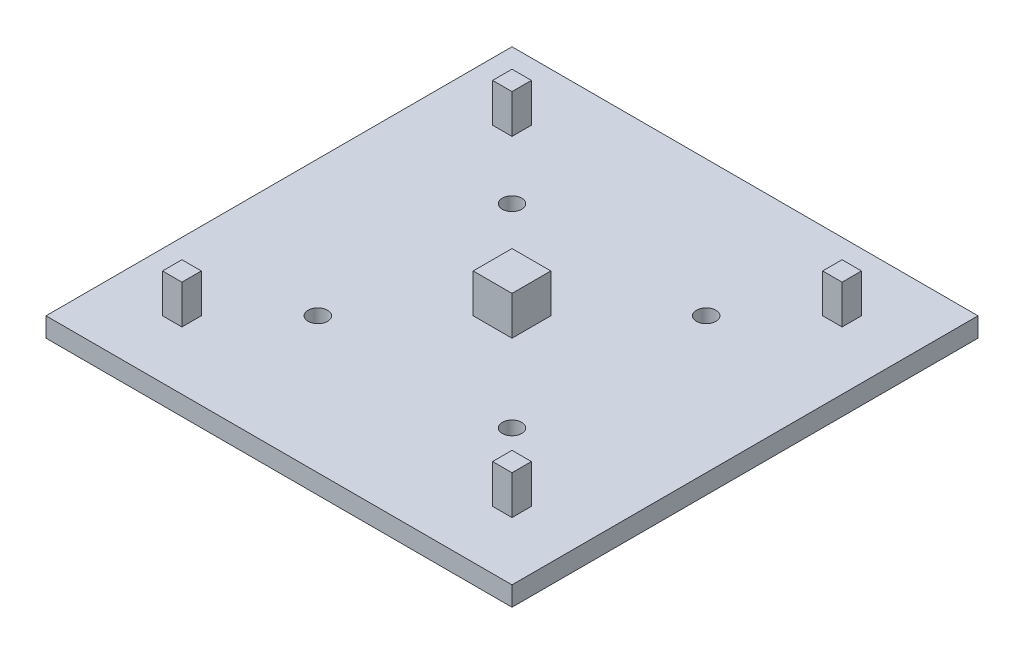
ISO-10303-21;
HEADER;
FILE_DESCRIPTION(('STEP AP214'),'2;1');
FILE_NAME('part.step','',(''),(''),'','','');
FILE_SCHEMA(('AUTOMOTIVE_DESIGN { 1 0 10303 214 1 1 1 1 }'));
ENDSEC;
DATA;
#1=APPLICATION_CONTEXT('core data for automotive mechanical design processes');
#2=APPLICATION_PROTOCOL_DEFINITION('international standard','automotive_design',2000,#1);
#3=PRODUCT_CONTEXT('',#1,'mechanical');
#4=PRODUCT('Part','Part','',(#3));
#5=PRODUCT_RELATED_PRODUCT_CATEGORY('part','',(#4));
#6=PRODUCT_DEFINITION_FORMATION('','',#4);
#7=PRODUCT_DEFINITION_CONTEXT('part definition',#1,'design');
#8=PRODUCT_DEFINITION('design','',#6,#7);
#9=PRODUCT_DEFINITION_SHAPE('','',#8);
#10=(LENGTH_UNIT() NAMED_UNIT(*) SI_UNIT(.MILLI.,.METRE.));
#11=(NAMED_UNIT(*) PLANE_ANGLE_UNIT() SI_UNIT($,.RADIAN.));
#12=(NAMED_UNIT(*) SI_UNIT($,.STERADIAN.) SOLID_ANGLE_UNIT());
#13=UNCERTAINTY_MEASURE_WITH_UNIT(LENGTH_MEASURE(1.E-05),#10,'distance_accuracy_value','');
#14=(GEOMETRIC_REPRESENTATION_CONTEXT(3) GLOBAL_UNCERTAINTY_ASSIGNED_CONTEXT((#13)) GLOBAL_UNIT_ASSIGNED_CONTEXT((#10,
#11,#12)) REPRESENTATION_CONTEXT('',''));
#15=CARTESIAN_POINT('',(0.,0.,0.));
#16=DIRECTION('',(0.,0.,1.));
#17=DIRECTION('',(1.,0.,0.));
#18=AXIS2_PLACEMENT_3D('',#15,#16,#17);
#19=CARTESIAN_POINT('',(0.,5.,0.));
#20=DIRECTION('',(0.,1.,0.));
#21=DIRECTION('',(0.,0.,1.));
#22=AXIS2_PLACEMENT_3D('',#19,#20,#21);
#23=PLANE('',#22);
#24=CARTESIAN_POINT('',(-25.,5.,25.));
#25=DIRECTION('',(0.,1.,0.));
#26=DIRECTION('',(0.,0.,1.));
#27=AXIS2_PLACEMENT_3D('',#24,#25,#26);
#28=CIRCLE('',#27,2.5);
#29=CARTESIAN_POINT('',(-25.,5.,27.5));
#30=VERTEX_POINT('',#29);
#31=EDGE_CURVE('E397',#30,#30,#28,.T.);
#32=ORIENTED_EDGE('',*,*,#31,.F.);
#33=EDGE_LOOP('',(#32));
#34=FACE_BOUND('',#33,.T.);
#35=CARTESIAN_POINT('',(25.,5.,25.));
#36=DIRECTION('',(0.,1.,0.));
#37=DIRECTION('',(0.,0.,1.));
#38=AXIS2_PLACEMENT_3D('',#35,#36,#37);
#39=CIRCLE('',#38,2.5);
#40=CARTESIAN_POINT('',(25.,5.,27.5));
#41=VERTEX_POINT('',#40);
#42=EDGE_CURVE('E402',#41,#41,#39,.T.);
#43=ORIENTED_EDGE('',*,*,#42,.F.);
#44=EDGE_LOOP('',(#43));
#45=FACE_BOUND('',#44,.T.);
#46=CARTESIAN_POINT('',(25.,5.,-25.));
#47=DIRECTION('',(0.,1.,0.));
#48=DIRECTION('',(0.,0.,1.));
#49=AXIS2_PLACEMENT_3D('',#46,#47,#48);
#50=CIRCLE('',#49,2.5);
#51=CARTESIAN_POINT('',(25.,5.,-22.5));
#52=VERTEX_POINT('',#51);
#53=EDGE_CURVE('E410',#52,#52,#50,.T.);
#54=ORIENTED_EDGE('',*,*,#53,.F.);
#55=EDGE_LOOP('',(#54));
#56=FACE_BOUND('',#55,.T.);
#57=CARTESIAN_POINT('',(-25.,5.,-25.));
#58=DIRECTION('',(0.,1.,0.));
#59=DIRECTION('',(0.,0.,1.));
#60=AXIS2_PLACEMENT_3D('',#57,#58,#59);
#61=CIRCLE('',#60,2.5);
#62=CARTESIAN_POINT('',(-25.,5.,-22.5));
#63=VERTEX_POINT('',#62);
#64=EDGE_CURVE('E418',#63,#63,#61,.T.);
#65=ORIENTED_EDGE('',*,*,#64,.F.);
#66=EDGE_LOOP('',(#65));
#67=FACE_BOUND('',#66,.T.);
#68=DIRECTION('',(0.,0.,-1.));
#69=VECTOR('',#68,1.);
#70=CARTESIAN_POINT('',(60.,5.,-60.));
#71=LINE('',#70,#69);
#72=CARTESIAN_POINT('',(60.,5.,60.));
#73=VERTEX_POINT('',#72);
#74=CARTESIAN_POINT('',(60.,5.,-60.));
#75=VERTEX_POINT('',#74);
#76=EDGE_CURVE('E430',#73,#75,#71,.T.);
#77=ORIENTED_EDGE('',*,*,#76,.T.);
#78=DIRECTION('',(-1.,0.,0.));
#79=VECTOR('',#78,1.);
#80=CARTESIAN_POINT('',(-60.,5.,-60.));
#81=LINE('',#80,#79);
#82=CARTESIAN_POINT('',(-60.,5.,-60.));
#83=VERTEX_POINT('',#82);
#84=EDGE_CURVE('E434',#75,#83,#81,.T.);
#85=ORIENTED_EDGE('',*,*,#84,.T.);
#86=DIRECTION('',(0.,0.,1.));
#87=VECTOR('',#86,1.);
#88=CARTESIAN_POINT('',(-60.,5.,-60.));
#89=LINE('',#88,#87);
#90=CARTESIAN_POINT('',(-60.,5.,60.));
#91=VERTEX_POINT('',#90);
#92=EDGE_CURVE('E438',#83,#91,#89,.T.);
#93=ORIENTED_EDGE('',*,*,#92,.T.);
#94=DIRECTION('',(1.,0.,0.));
#95=VECTOR('',#94,1.);
#96=CARTESIAN_POINT('',(-60.,5.,60.));
#97=LINE('',#96,#95);
#98=EDGE_CURVE('E441',#91,#73,#97,.T.);
#99=ORIENTED_EDGE('',*,*,#98,.T.);
#100=EDGE_LOOP('',(#77,#85,#93,#99));
#101=FACE_BOUND('',#100,.T.);
#102=DIRECTION('',(-1.,0.,0.));
#103=VECTOR('',#102,1.);
#104=CARTESIAN_POINT('',(-5.,5.,-5.));
#105=LINE('',#104,#103);
#106=CARTESIAN_POINT('',(5.,5.,-5.));
#107=VERTEX_POINT('',#106);
#108=CARTESIAN_POINT('',(-5.,5.,-5.));
#109=VERTEX_POINT('',#108);
#110=EDGE_CURVE('E375',#107,#109,#105,.T.);
#111=ORIENTED_EDGE('',*,*,#110,.F.);
#112=DIRECTION('',(0.,0.,-1.));
#113=VECTOR('',#112,1.);
#114=CARTESIAN_POINT('',(5.,5.,-5.));
#115=LINE('',#114,#113);
#116=CARTESIAN_POINT('',(5.,5.,5.));
#117=VERTEX_POINT('',#116);
#118=EDGE_CURVE('E356',#117,#107,#115,.T.);
#119=ORIENTED_EDGE('',*,*,#118,.F.);
#120=DIRECTION('',(1.,0.,0.));
#121=VECTOR('',#120,1.);
#122=CARTESIAN_POINT('',(-5.,5.,5.));
#123=LINE('',#122,#121);
#124=CARTESIAN_POINT('',(-5.,5.,5.));
#125=VERTEX_POINT('',#124);
#126=EDGE_CURVE('E362',#125,#117,#123,.T.);
#127=ORIENTED_EDGE('',*,*,#126,.F.);
#128=DIRECTION('',(0.,0.,1.));
#129=VECTOR('',#128,1.);
#130=CARTESIAN_POINT('',(-5.,5.,-5.));
#131=LINE('',#130,#129);
#132=EDGE_CURVE('E378',#109,#125,#131,.T.);
#133=ORIENTED_EDGE('',*,*,#132,.F.);
#134=EDGE_LOOP('',(#111,#119,#127,#133));
#135=FACE_BOUND('',#134,.T.);
#136=DIRECTION('',(-1.,0.,0.));
#137=VECTOR('',#136,1.);
#138=CARTESIAN_POINT('',(40.,5.,-45.));
#139=LINE('',#138,#137);
#140=CARTESIAN_POINT('',(45.,5.,-45.));
#141=VERTEX_POINT('',#140);
#142=CARTESIAN_POINT('',(40.,5.,-45.));
#143=VERTEX_POINT('',#142);
#144=EDGE_CURVE('E334',#141,#143,#139,.T.);
#145=ORIENTED_EDGE('',*,*,#144,.F.);
#146=DIRECTION('',(0.,0.,-1.));
#147=VECTOR('',#146,1.);
#148=CARTESIAN_POINT('',(45.,5.,-45.));
#149=LINE('',#148,#147);
#150=CARTESIAN_POINT('',(45.,5.,-40.));
#151=VERTEX_POINT('',#150);
#152=EDGE_CURVE('E315',#151,#141,#149,.T.);
#153=ORIENTED_EDGE('',*,*,#152,.F.);
#154=DIRECTION('',(1.,0.,0.));
#155=VECTOR('',#154,1.);
#156=CARTESIAN_POINT('',(40.,5.,-40.));
#157=LINE('',#156,#155);
#158=CARTESIAN_POINT('',(40.,5.,-40.));
#159=VERTEX_POINT('',#158);
#160=EDGE_CURVE('E321',#159,#151,#157,.T.);
#161=ORIENTED_EDGE('',*,*,#160,.F.);
#162=DIRECTION('',(0.,0.,1.));
#163=VECTOR('',#162,1.);
#164=CARTESIAN_POINT('',(40.,5.,-45.));
#165=LINE('',#164,#163);
#166=EDGE_CURVE('E337',#143,#159,#165,.T.);
#167=ORIENTED_EDGE('',*,*,#166,.F.);
#168=EDGE_LOOP('',(#145,#153,#161,#167));
#169=FACE_BOUND('',#168,.T.);
#170=DIRECTION('',(-1.,0.,0.));
#171=VECTOR('',#170,1.);
#172=CARTESIAN_POINT('',(-45.,5.,-45.));
#173=LINE('',#172,#171);
#174=CARTESIAN_POINT('',(-40.,5.,-45.));
#175=VERTEX_POINT('',#174);
#176=CARTESIAN_POINT('',(-45.,5.,-45.));
#177=VERTEX_POINT('',#176);
#178=EDGE_CURVE('E293',#175,#177,#173,.T.);
#179=ORIENTED_EDGE('',*,*,#178,.F.);
#180=DIRECTION('',(0.,0.,-1.));
#181=VECTOR('',#180,1.);
#182=CARTESIAN_POINT('',(-40.,5.,-45.));
#183=LINE('',#182,#181);
#184=CARTESIAN_POINT('',(-40.,5.,-40.));
#185=VERTEX_POINT('',#184);
#186=EDGE_CURVE('E274',#185,#175,#183,.T.);
#187=ORIENTED_EDGE('',*,*,#186,.F.);
#188=DIRECTION('',(1.,0.,0.));
#189=VECTOR('',#188,1.);
#190=CARTESIAN_POINT('',(-45.,5.,-40.));
#191=LINE('',#190,#189);
#192=CARTESIAN_POINT('',(-45.,5.,-40.));
#193=VERTEX_POINT('',#192);
#194=EDGE_CURVE('E280',#193,#185,#191,.T.);
#195=ORIENTED_EDGE('',*,*,#194,.F.);
#196=DIRECTION('',(0.,0.,1.));
#197=VECTOR('',#196,1.);
#198=CARTESIAN_POINT('',(-45.,5.,-45.));
#199=LINE('',#198,#197);
#200=EDGE_CURVE('E296',#177,#193,#199,.T.);
#201=ORIENTED_EDGE('',*,*,#200,.F.);
#202=EDGE_LOOP('',(#179,#187,#195,#201));
#203=FACE_BOUND('',#202,.T.);
#204=DIRECTION('',(-1.,0.,0.));
#205=VECTOR('',#204,1.);
#206=CARTESIAN_POINT('',(40.,5.,40.));
#207=LINE('',#206,#205);
#208=CARTESIAN_POINT('',(45.,5.,40.));
#209=VERTEX_POINT('',#208);
#210=CARTESIAN_POINT('',(40.,5.,40.));
#211=VERTEX_POINT('',#210);
#212=EDGE_CURVE('E235',#209,#211,#207,.T.);
#213=ORIENTED_EDGE('',*,*,#212,.F.);
#214=DIRECTION('',(0.,0.,-1.));
#215=VECTOR('',#214,1.);
#216=CARTESIAN_POINT('',(45.,5.,40.));
#217=LINE('',#216,#215);
#218=CARTESIAN_POINT('',(45.,5.,45.));
#219=VERTEX_POINT('',#218);
#220=EDGE_CURVE('E230',#219,#209,#217,.T.);
#221=ORIENTED_EDGE('',*,*,#220,.F.);
#222=DIRECTION('',(1.,0.,0.));
#223=VECTOR('',#222,1.);
#224=CARTESIAN_POINT('',(40.,5.,45.));
#225=LINE('',#224,#223);
#226=CARTESIAN_POINT('',(40.,5.,45.));
#227=VERTEX_POINT('',#226);
#228=EDGE_CURVE('E245',#227,#219,#225,.T.);
#229=ORIENTED_EDGE('',*,*,#228,.F.);
#230=DIRECTION('',(0.,0.,1.));
#231=VECTOR('',#230,1.);
#232=CARTESIAN_POINT('',(40.,5.,40.));
#233=LINE('',#232,#231);
#234=EDGE_CURVE('E257',#211,#227,#233,.T.);
#235=ORIENTED_EDGE('',*,*,#234,.F.);
#236=EDGE_LOOP('',(#213,#221,#229,#235));
#237=FACE_BOUND('',#236,.T.);
#238=DIRECTION('',(-1.,0.,0.));
#239=VECTOR('',#238,1.);
#240=CARTESIAN_POINT('',(-45.,5.,40.));
#241=LINE('',#240,#239);
#242=CARTESIAN_POINT('',(-40.,5.,40.));
#243=VERTEX_POINT('',#242);
#244=CARTESIAN_POINT('',(-45.,5.,40.));
#245=VERTEX_POINT('',#244);
#246=EDGE_CURVE('E826',#243,#245,#241,.T.);
#247=ORIENTED_EDGE('',*,*,#246,.F.);
#248=DIRECTION('',(0.,0.,-1.));
#249=VECTOR('',#248,1.);
#250=CARTESIAN_POINT('',(-40.,5.,40.));
#251=LINE('',#250,#249);
#252=CARTESIAN_POINT('',(-40.,5.,45.));
#253=VERTEX_POINT('',#252);
#254=EDGE_CURVE('E227',#253,#243,#251,.T.);
#255=ORIENTED_EDGE('',*,*,#254,.F.);
#256=DIRECTION('',(1.,0.,0.));
#257=VECTOR('',#256,1.);
#258=CARTESIAN_POINT('',(-45.,5.,45.));
#259=LINE('',#258,#257);
#260=CARTESIAN_POINT('',(-45.,5.,45.));
#261=VERTEX_POINT('',#260);
#262=EDGE_CURVE('E223',#261,#253,#259,.T.);
#263=ORIENTED_EDGE('',*,*,#262,.F.);
#264=DIRECTION('',(0.,0.,1.));
#265=VECTOR('',#264,1.);
#266=CARTESIAN_POINT('',(-45.,5.,40.));
#267=LINE('',#266,#265);
#268=EDGE_CURVE('E822',#245,#261,#267,.T.);
#269=ORIENTED_EDGE('',*,*,#268,.F.);
#270=EDGE_LOOP('',(#247,#255,#263,#269));
#271=FACE_BOUND('',#270,.T.);
#272=ADVANCED_FACE('F39',(#34,#45,#56,#67,#101,#135,#169,#203,#237,#271),#23,.T.);
#273=CARTESIAN_POINT('',(60.,5.,-60.));
#274=DIRECTION('',(-1.,0.,0.));
#275=DIRECTION('',(0.,0.,1.));
#276=AXIS2_PLACEMENT_3D('',#273,#274,#275);
#277=PLANE('',#276);
#278=DIRECTION('',(0.,0.,-1.));
#279=VECTOR('',#278,1.);
#280=CARTESIAN_POINT('',(60.,0.,-60.));
#281=LINE('',#280,#279);
#282=CARTESIAN_POINT('',(60.,0.,60.));
#283=VERTEX_POINT('',#282);
#284=CARTESIAN_POINT('',(60.,0.,-60.));
#285=VERTEX_POINT('',#284);
#286=EDGE_CURVE('E426',#283,#285,#281,.T.);
#287=ORIENTED_EDGE('',*,*,#286,.T.);
#288=DIRECTION('',(0.,-1.,0.));
#289=VECTOR('',#288,1.);
#290=CARTESIAN_POINT('',(60.,5.,-60.));
#291=LINE('',#290,#289);
#292=EDGE_CURVE('E11',#75,#285,#291,.T.);
#293=ORIENTED_EDGE('',*,*,#292,.F.);
#294=ORIENTED_EDGE('',*,*,#76,.F.);
#295=DIRECTION('',(0.,-1.,0.));
#296=VECTOR('',#295,1.);
#297=CARTESIAN_POINT('',(60.,5.,60.));
#298=LINE('',#297,#296);
#299=EDGE_CURVE('E444',#73,#283,#298,.T.);
#300=ORIENTED_EDGE('',*,*,#299,.T.);
#301=EDGE_LOOP('',(#287,#293,#294,#300));
#302=FACE_BOUND('',#301,.T.);
#303=ADVANCED_FACE('F41',(#302),#277,.F.);
#304=CARTESIAN_POINT('',(-60.,5.,-60.));
#305=DIRECTION('',(0.,0.,1.));
#306=DIRECTION('',(1.,0.,0.));
#307=AXIS2_PLACEMENT_3D('',#304,#305,#306);
#308=PLANE('',#307);
#309=DIRECTION('',(-1.,0.,0.));
#310=VECTOR('',#309,1.);
#311=CARTESIAN_POINT('',(-60.,0.,-60.));
#312=LINE('',#311,#310);
#313=CARTESIAN_POINT('',(-60.,0.,-60.));
#314=VERTEX_POINT('',#313);
#315=EDGE_CURVE('E448',#285,#314,#312,.T.);
#316=ORIENTED_EDGE('',*,*,#315,.T.);
#317=DIRECTION('',(0.,-1.,0.));
#318=VECTOR('',#317,1.);
#319=CARTESIAN_POINT('',(-60.,5.,-60.));
#320=LINE('',#319,#318);
#321=EDGE_CURVE('E48',#83,#314,#320,.T.);
#322=ORIENTED_EDGE('',*,*,#321,.F.);
#323=ORIENTED_EDGE('',*,*,#84,.F.);
#324=ORIENTED_EDGE('',*,*,#292,.T.);
#325=EDGE_LOOP('',(#316,#322,#323,#324));
#326=FACE_BOUND('',#325,.T.);
#327=ADVANCED_FACE('F484',(#326),#308,.F.);
#328=CARTESIAN_POINT('',(-60.,5.,-60.));
#329=DIRECTION('',(1.,0.,0.));
#330=DIRECTION('',(0.,0.,-1.));
#331=AXIS2_PLACEMENT_3D('',#328,#329,#330);
#332=PLANE('',#331);
#333=DIRECTION('',(0.,0.,1.));
#334=VECTOR('',#333,1.);
#335=CARTESIAN_POINT('',(-60.,0.,-60.));
#336=LINE('',#335,#334);
#337=CARTESIAN_POINT('',(-60.,0.,60.));
#338=VERTEX_POINT('',#337);
#339=EDGE_CURVE('E451',#314,#338,#336,.T.);
#340=ORIENTED_EDGE('',*,*,#339,.T.);
#341=DIRECTION('',(0.,-1.,0.));
#342=VECTOR('',#341,1.);
#343=CARTESIAN_POINT('',(-60.,5.,60.));
#344=LINE('',#343,#342);
#345=EDGE_CURVE('E459',#91,#338,#344,.T.);
#346=ORIENTED_EDGE('',*,*,#345,.F.);
#347=ORIENTED_EDGE('',*,*,#92,.F.);
#348=ORIENTED_EDGE('',*,*,#321,.T.);
#349=EDGE_LOOP('',(#340,#346,#347,#348));
#350=FACE_BOUND('',#349,.T.);
#351=ADVANCED_FACE('F468',(#350),#332,.F.);
#352=CARTESIAN_POINT('',(-60.,5.,60.));
#353=DIRECTION('',(0.,0.,-1.));
#354=DIRECTION('',(-1.,0.,0.));
#355=AXIS2_PLACEMENT_3D('',#352,#353,#354);
#356=PLANE('',#355);
#357=DIRECTION('',(1.,0.,0.));
#358=VECTOR('',#357,1.);
#359=CARTESIAN_POINT('',(-60.,0.,60.));
#360=LINE('',#359,#358);
#361=EDGE_CURVE('E435',#338,#283,#360,.T.);
#362=ORIENTED_EDGE('',*,*,#361,.T.);
#363=ORIENTED_EDGE('',*,*,#299,.F.);
#364=ORIENTED_EDGE('',*,*,#98,.F.);
#365=ORIENTED_EDGE('',*,*,#345,.T.);
#366=EDGE_LOOP('',(#362,#363,#364,#365));
#367=FACE_BOUND('',#366,.T.);
#368=ADVANCED_FACE('F477',(#367),#356,.F.);
#369=CARTESIAN_POINT('',(0.,0.,0.));
#370=DIRECTION('',(0.,1.,0.));
#371=DIRECTION('',(0.,0.,1.));
#372=AXIS2_PLACEMENT_3D('',#369,#370,#371);
#373=PLANE('',#372);
#374=CARTESIAN_POINT('',(-25.,0.,25.));
#375=DIRECTION('',(0.,1.,0.));
#376=DIRECTION('',(0.,0.,1.));
#377=AXIS2_PLACEMENT_3D('',#374,#375,#376);
#378=CIRCLE('',#377,2.5);
#379=CARTESIAN_POINT('',(-25.,0.,27.5));
#380=VERTEX_POINT('',#379);
#381=EDGE_CURVE('E398',#380,#380,#378,.T.);
#382=ORIENTED_EDGE('',*,*,#381,.T.);
#383=EDGE_LOOP('',(#382));
#384=FACE_BOUND('',#383,.T.);
#385=CARTESIAN_POINT('',(25.,0.,25.));
#386=DIRECTION('',(0.,1.,0.));
#387=DIRECTION('',(0.,0.,1.));
#388=AXIS2_PLACEMENT_3D('',#385,#386,#387);
#389=CIRCLE('',#388,2.5);
#390=CARTESIAN_POINT('',(25.,0.,27.5));
#391=VERTEX_POINT('',#390);
#392=EDGE_CURVE('E406',#391,#391,#389,.T.);
#393=ORIENTED_EDGE('',*,*,#392,.T.);
#394=EDGE_LOOP('',(#393));
#395=FACE_BOUND('',#394,.T.);
#396=CARTESIAN_POINT('',(25.,0.,-25.));
#397=DIRECTION('',(0.,1.,0.));
#398=DIRECTION('',(0.,0.,1.));
#399=AXIS2_PLACEMENT_3D('',#396,#397,#398);
#400=CIRCLE('',#399,2.5);
#401=CARTESIAN_POINT('',(25.,0.,-22.5));
#402=VERTEX_POINT('',#401);
#403=EDGE_CURVE('E414',#402,#402,#400,.T.);
#404=ORIENTED_EDGE('',*,*,#403,.T.);
#405=EDGE_LOOP('',(#404));
#406=FACE_BOUND('',#405,.T.);
#407=CARTESIAN_POINT('',(-25.,0.,-25.));
#408=DIRECTION('',(0.,1.,0.));
#409=DIRECTION('',(0.,0.,1.));
#410=AXIS2_PLACEMENT_3D('',#407,#408,#409);
#411=CIRCLE('',#410,2.5);
#412=CARTESIAN_POINT('',(-25.,0.,-22.5));
#413=VERTEX_POINT('',#412);
#414=EDGE_CURVE('E422',#413,#413,#411,.T.);
#415=ORIENTED_EDGE('',*,*,#414,.T.);
#416=EDGE_LOOP('',(#415));
#417=FACE_BOUND('',#416,.T.);
#418=ORIENTED_EDGE('',*,*,#286,.F.);
#419=ORIENTED_EDGE('',*,*,#361,.F.);
#420=ORIENTED_EDGE('',*,*,#339,.F.);
#421=ORIENTED_EDGE('',*,*,#315,.F.);
#422=EDGE_LOOP('',(#418,#419,#420,#421));
#423=FACE_BOUND('',#422,.T.);
#424=ADVANCED_FACE('F474',(#384,#395,#406,#417,#423),#373,.F.);
#425=CARTESIAN_POINT('',(-25.,0.,-25.));
#426=DIRECTION('',(0.,1.,0.));
#427=DIRECTION('',(0.,0.,1.));
#428=AXIS2_PLACEMENT_3D('',#425,#426,#427);
#429=CYLINDRICAL_SURFACE('',#428,2.5);
#430=ORIENTED_EDGE('',*,*,#414,.F.);
#431=EDGE_LOOP('',(#430));
#432=FACE_BOUND('',#431,.T.);
#433=ORIENTED_EDGE('',*,*,#64,.T.);
#434=EDGE_LOOP('',(#433));
#435=FACE_BOUND('',#434,.T.);
#436=ADVANCED_FACE('F500',(#432,#435),#429,.F.);
#437=CARTESIAN_POINT('',(25.,0.,-25.));
#438=DIRECTION('',(0.,1.,0.));
#439=DIRECTION('',(0.,0.,1.));
#440=AXIS2_PLACEMENT_3D('',#437,#438,#439);
#441=CYLINDRICAL_SURFACE('',#440,2.5);
#442=ORIENTED_EDGE('',*,*,#403,.F.);
#443=EDGE_LOOP('',(#442));
#444=FACE_BOUND('',#443,.T.);
#445=ORIENTED_EDGE('',*,*,#53,.T.);
#446=EDGE_LOOP('',(#445));
#447=FACE_BOUND('',#446,.T.);
#448=ADVANCED_FACE('F522',(#444,#447),#441,.F.);
#449=CARTESIAN_POINT('',(25.,0.,25.));
#450=DIRECTION('',(0.,1.,0.));
#451=DIRECTION('',(0.,0.,1.));
#452=AXIS2_PLACEMENT_3D('',#449,#450,#451);
#453=CYLINDRICAL_SURFACE('',#452,2.5);
#454=ORIENTED_EDGE('',*,*,#392,.F.);
#455=EDGE_LOOP('',(#454));
#456=FACE_BOUND('',#455,.T.);
#457=ORIENTED_EDGE('',*,*,#42,.T.);
#458=EDGE_LOOP('',(#457));
#459=FACE_BOUND('',#458,.T.);
#460=ADVANCED_FACE('F529',(#456,#459),#453,.F.);
#461=CARTESIAN_POINT('',(-25.,0.,25.));
#462=DIRECTION('',(0.,1.,0.));
#463=DIRECTION('',(0.,0.,1.));
#464=AXIS2_PLACEMENT_3D('',#461,#462,#463);
#465=CYLINDRICAL_SURFACE('',#464,2.5);
#466=ORIENTED_EDGE('',*,*,#381,.F.);
#467=EDGE_LOOP('',(#466));
#468=FACE_BOUND('',#467,.T.);
#469=ORIENTED_EDGE('',*,*,#31,.T.);
#470=EDGE_LOOP('',(#469));
#471=FACE_BOUND('',#470,.T.);
#472=ADVANCED_FACE('F535',(#468,#471),#465,.F.);
#473=CARTESIAN_POINT('',(5.,15.,-5.));
#474=DIRECTION('',(-1.,0.,0.));
#475=DIRECTION('',(0.,0.,1.));
#476=AXIS2_PLACEMENT_3D('',#473,#474,#475);
#477=PLANE('',#476);
#478=ORIENTED_EDGE('',*,*,#118,.T.);
#479=DIRECTION('',(0.,-1.,0.));
#480=VECTOR('',#479,1.);
#481=CARTESIAN_POINT('',(5.,15.,-5.));
#482=LINE('',#481,#480);
#483=CARTESIAN_POINT('',(5.,15.,-5.));
#484=VERTEX_POINT('',#483);
#485=EDGE_CURVE('E394',#484,#107,#482,.T.);
#486=ORIENTED_EDGE('',*,*,#485,.F.);
#487=DIRECTION('',(0.,0.,-1.));
#488=VECTOR('',#487,1.);
#489=CARTESIAN_POINT('',(5.,15.,-5.));
#490=LINE('',#489,#488);
#491=CARTESIAN_POINT('',(5.,15.,5.));
#492=VERTEX_POINT('',#491);
#493=EDGE_CURVE('E357',#492,#484,#490,.T.);
#494=ORIENTED_EDGE('',*,*,#493,.F.);
#495=DIRECTION('',(0.,-1.,0.));
#496=VECTOR('',#495,1.);
#497=CARTESIAN_POINT('',(5.,15.,5.));
#498=LINE('',#497,#496);
#499=EDGE_CURVE('E371',#492,#117,#498,.T.);
#500=ORIENTED_EDGE('',*,*,#499,.T.);
#501=EDGE_LOOP('',(#478,#486,#494,#500));
#502=FACE_BOUND('',#501,.T.);
#503=ADVANCED_FACE('F542',(#502),#477,.F.);
#504=CARTESIAN_POINT('',(-5.,15.,-5.));
#505=DIRECTION('',(0.,0.,1.));
#506=DIRECTION('',(1.,0.,0.));
#507=AXIS2_PLACEMENT_3D('',#504,#505,#506);
#508=PLANE('',#507);
#509=ORIENTED_EDGE('',*,*,#110,.T.);
#510=DIRECTION('',(0.,-1.,0.));
#511=VECTOR('',#510,1.);
#512=CARTESIAN_POINT('',(-5.,15.,-5.));
#513=LINE('',#512,#511);
#514=CARTESIAN_POINT('',(-5.,15.,-5.));
#515=VERTEX_POINT('',#514);
#516=EDGE_CURVE('E390',#515,#109,#513,.T.);
#517=ORIENTED_EDGE('',*,*,#516,.F.);
#518=DIRECTION('',(-1.,0.,0.));
#519=VECTOR('',#518,1.);
#520=CARTESIAN_POINT('',(-5.,15.,-5.));
#521=LINE('',#520,#519);
#522=EDGE_CURVE('E361',#484,#515,#521,.T.);
#523=ORIENTED_EDGE('',*,*,#522,.F.);
#524=ORIENTED_EDGE('',*,*,#485,.T.);
#525=EDGE_LOOP('',(#509,#517,#523,#524));
#526=FACE_BOUND('',#525,.T.);
#527=ADVANCED_FACE('F550',(#526),#508,.F.);
#528=CARTESIAN_POINT('',(-5.,15.,-5.));
#529=DIRECTION('',(1.,0.,0.));
#530=DIRECTION('',(0.,0.,-1.));
#531=AXIS2_PLACEMENT_3D('',#528,#529,#530);
#532=PLANE('',#531);
#533=ORIENTED_EDGE('',*,*,#132,.T.);
#534=DIRECTION('',(0.,-1.,0.));
#535=VECTOR('',#534,1.);
#536=CARTESIAN_POINT('',(-5.,15.,5.));
#537=LINE('',#536,#535);
#538=CARTESIAN_POINT('',(-5.,15.,5.));
#539=VERTEX_POINT('',#538);
#540=EDGE_CURVE('E387',#539,#125,#537,.T.);
#541=ORIENTED_EDGE('',*,*,#540,.F.);
#542=DIRECTION('',(0.,0.,1.));
#543=VECTOR('',#542,1.);
#544=CARTESIAN_POINT('',(-5.,15.,-5.));
#545=LINE('',#544,#543);
#546=EDGE_CURVE('E365',#515,#539,#545,.T.);
#547=ORIENTED_EDGE('',*,*,#546,.F.);
#548=ORIENTED_EDGE('',*,*,#516,.T.);
#549=EDGE_LOOP('',(#533,#541,#547,#548));
#550=FACE_BOUND('',#549,.T.);
#551=ADVANCED_FACE('F558',(#550),#532,.F.);
#552=CARTESIAN_POINT('',(-5.,15.,5.));
#553=DIRECTION('',(0.,0.,-1.));
#554=DIRECTION('',(-1.,0.,0.));
#555=AXIS2_PLACEMENT_3D('',#552,#553,#554);
#556=PLANE('',#555);
#557=ORIENTED_EDGE('',*,*,#126,.T.);
#558=ORIENTED_EDGE('',*,*,#499,.F.);
#559=DIRECTION('',(1.,0.,0.));
#560=VECTOR('',#559,1.);
#561=CARTESIAN_POINT('',(-5.,15.,5.));
#562=LINE('',#561,#560);
#563=EDGE_CURVE('E368',#539,#492,#562,.T.);
#564=ORIENTED_EDGE('',*,*,#563,.F.);
#565=ORIENTED_EDGE('',*,*,#540,.T.);
#566=EDGE_LOOP('',(#557,#558,#564,#565));
#567=FACE_BOUND('',#566,.T.);
#568=ADVANCED_FACE('F566',(#567),#556,.F.);
#569=CARTESIAN_POINT('',(0.,15.,0.));
#570=DIRECTION('',(0.,1.,0.));
#571=DIRECTION('',(0.,0.,1.));
#572=AXIS2_PLACEMENT_3D('',#569,#570,#571);
#573=PLANE('',#572);
#574=ORIENTED_EDGE('',*,*,#493,.T.);
#575=ORIENTED_EDGE('',*,*,#522,.T.);
#576=ORIENTED_EDGE('',*,*,#546,.T.);
#577=ORIENTED_EDGE('',*,*,#563,.T.);
#578=EDGE_LOOP('',(#574,#575,#576,#577));
#579=FACE_BOUND('',#578,.T.);
#580=ADVANCED_FACE('F574',(#579),#573,.T.);
#581=CARTESIAN_POINT('',(45.,15.,-45.));
#582=DIRECTION('',(-1.,0.,0.));
#583=DIRECTION('',(0.,0.,1.));
#584=AXIS2_PLACEMENT_3D('',#581,#582,#583);
#585=PLANE('',#584);
#586=ORIENTED_EDGE('',*,*,#152,.T.);
#587=DIRECTION('',(0.,-1.,0.));
#588=VECTOR('',#587,1.);
#589=CARTESIAN_POINT('',(45.,15.,-45.));
#590=LINE('',#589,#588);
#591=CARTESIAN_POINT('',(45.,15.,-45.));
#592=VERTEX_POINT('',#591);
#593=EDGE_CURVE('E353',#592,#141,#590,.T.);
#594=ORIENTED_EDGE('',*,*,#593,.F.);
#595=DIRECTION('',(0.,0.,-1.));
#596=VECTOR('',#595,1.);
#597=CARTESIAN_POINT('',(45.,15.,-45.));
#598=LINE('',#597,#596);
#599=CARTESIAN_POINT('',(45.,15.,-40.));
#600=VERTEX_POINT('',#599);
#601=EDGE_CURVE('E316',#600,#592,#598,.T.);
#602=ORIENTED_EDGE('',*,*,#601,.F.);
#603=DIRECTION('',(0.,-1.,0.));
#604=VECTOR('',#603,1.);
#605=CARTESIAN_POINT('',(45.,15.,-40.));
#606=LINE('',#605,#604);
#607=EDGE_CURVE('E330',#600,#151,#606,.T.);
#608=ORIENTED_EDGE('',*,*,#607,.T.);
#609=EDGE_LOOP('',(#586,#594,#602,#608));
#610=FACE_BOUND('',#609,.T.);
#611=ADVANCED_FACE('F582',(#610),#585,.F.);
#612=CARTESIAN_POINT('',(40.,15.,-45.));
#613=DIRECTION('',(0.,0.,1.));
#614=DIRECTION('',(1.,0.,0.));
#615=AXIS2_PLACEMENT_3D('',#612,#613,#614);
#616=PLANE('',#615);
#617=ORIENTED_EDGE('',*,*,#144,.T.);
#618=DIRECTION('',(0.,-1.,0.));
#619=VECTOR('',#618,1.);
#620=CARTESIAN_POINT('',(40.,15.,-45.));
#621=LINE('',#620,#619);
#622=CARTESIAN_POINT('',(40.,15.,-45.));
#623=VERTEX_POINT('',#622);
#624=EDGE_CURVE('E349',#623,#143,#621,.T.);
#625=ORIENTED_EDGE('',*,*,#624,.F.);
#626=DIRECTION('',(-1.,0.,0.));
#627=VECTOR('',#626,1.);
#628=CARTESIAN_POINT('',(40.,15.,-45.));
#629=LINE('',#628,#627);
#630=EDGE_CURVE('E320',#592,#623,#629,.T.);
#631=ORIENTED_EDGE('',*,*,#630,.F.);
#632=ORIENTED_EDGE('',*,*,#593,.T.);
#633=EDGE_LOOP('',(#617,#625,#631,#632));
#634=FACE_BOUND('',#633,.T.);
#635=ADVANCED_FACE('F590',(#634),#616,.F.);
#636=CARTESIAN_POINT('',(40.,15.,-45.));
#637=DIRECTION('',(1.,0.,0.));
#638=DIRECTION('',(0.,0.,-1.));
#639=AXIS2_PLACEMENT_3D('',#636,#637,#638);
#640=PLANE('',#639);
#641=ORIENTED_EDGE('',*,*,#166,.T.);
#642=DIRECTION('',(0.,-1.,0.));
#643=VECTOR('',#642,1.);
#644=CARTESIAN_POINT('',(40.,15.,-40.));
#645=LINE('',#644,#643);
#646=CARTESIAN_POINT('',(40.,15.,-40.));
#647=VERTEX_POINT('',#646);
#648=EDGE_CURVE('E346',#647,#159,#645,.T.);
#649=ORIENTED_EDGE('',*,*,#648,.F.);
#650=DIRECTION('',(0.,0.,1.));
#651=VECTOR('',#650,1.);
#652=CARTESIAN_POINT('',(40.,15.,-45.));
#653=LINE('',#652,#651);
#654=EDGE_CURVE('E324',#623,#647,#653,.T.);
#655=ORIENTED_EDGE('',*,*,#654,.F.);
#656=ORIENTED_EDGE('',*,*,#624,.T.);
#657=EDGE_LOOP('',(#641,#649,#655,#656));
#658=FACE_BOUND('',#657,.T.);
#659=ADVANCED_FACE('F598',(#658),#640,.F.);
#660=CARTESIAN_POINT('',(40.,15.,-40.));
#661=DIRECTION('',(0.,0.,-1.));
#662=DIRECTION('',(-1.,0.,0.));
#663=AXIS2_PLACEMENT_3D('',#660,#661,#662);
#664=PLANE('',#663);
#665=ORIENTED_EDGE('',*,*,#160,.T.);
#666=ORIENTED_EDGE('',*,*,#607,.F.);
#667=DIRECTION('',(1.,0.,0.));
#668=VECTOR('',#667,1.);
#669=CARTESIAN_POINT('',(40.,15.,-40.));
#670=LINE('',#669,#668);
#671=EDGE_CURVE('E327',#647,#600,#670,.T.);
#672=ORIENTED_EDGE('',*,*,#671,.F.);
#673=ORIENTED_EDGE('',*,*,#648,.T.);
#674=EDGE_LOOP('',(#665,#666,#672,#673));
#675=FACE_BOUND('',#674,.T.);
#676=ADVANCED_FACE('F606',(#675),#664,.F.);
#677=CARTESIAN_POINT('',(0.,15.,0.));
#678=DIRECTION('',(0.,1.,0.));
#679=DIRECTION('',(0.,0.,1.));
#680=AXIS2_PLACEMENT_3D('',#677,#678,#679);
#681=PLANE('',#680);
#682=ORIENTED_EDGE('',*,*,#601,.T.);
#683=ORIENTED_EDGE('',*,*,#630,.T.);
#684=ORIENTED_EDGE('',*,*,#654,.T.);
#685=ORIENTED_EDGE('',*,*,#671,.T.);
#686=EDGE_LOOP('',(#682,#683,#684,#685));
#687=FACE_BOUND('',#686,.T.);
#688=ADVANCED_FACE('F614',(#687),#681,.T.);
#689=CARTESIAN_POINT('',(-40.,15.,-45.));
#690=DIRECTION('',(-1.,0.,0.));
#691=DIRECTION('',(0.,0.,1.));
#692=AXIS2_PLACEMENT_3D('',#689,#690,#691);
#693=PLANE('',#692);
#694=ORIENTED_EDGE('',*,*,#186,.T.);
#695=DIRECTION('',(0.,-1.,0.));
#696=VECTOR('',#695,1.);
#697=CARTESIAN_POINT('',(-40.,15.,-45.));
#698=LINE('',#697,#696);
#699=CARTESIAN_POINT('',(-40.,15.,-45.));
#700=VERTEX_POINT('',#699);
#701=EDGE_CURVE('E312',#700,#175,#698,.T.);
#702=ORIENTED_EDGE('',*,*,#701,.F.);
#703=DIRECTION('',(0.,0.,-1.));
#704=VECTOR('',#703,1.);
#705=CARTESIAN_POINT('',(-40.,15.,-45.));
#706=LINE('',#705,#704);
#707=CARTESIAN_POINT('',(-40.,15.,-40.));
#708=VERTEX_POINT('',#707);
#709=EDGE_CURVE('E275',#708,#700,#706,.T.);
#710=ORIENTED_EDGE('',*,*,#709,.F.);
#711=DIRECTION('',(0.,-1.,0.));
#712=VECTOR('',#711,1.);
#713=CARTESIAN_POINT('',(-40.,15.,-40.));
#714=LINE('',#713,#712);
#715=EDGE_CURVE('E289',#708,#185,#714,.T.);
#716=ORIENTED_EDGE('',*,*,#715,.T.);
#717=EDGE_LOOP('',(#694,#702,#710,#716));
#718=FACE_BOUND('',#717,.T.);
#719=ADVANCED_FACE('F622',(#718),#693,.F.);
#720=CARTESIAN_POINT('',(-45.,15.,-45.));
#721=DIRECTION('',(0.,0.,1.));
#722=DIRECTION('',(1.,0.,0.));
#723=AXIS2_PLACEMENT_3D('',#720,#721,#722);
#724=PLANE('',#723);
#725=ORIENTED_EDGE('',*,*,#178,.T.);
#726=DIRECTION('',(0.,-1.,0.));
#727=VECTOR('',#726,1.);
#728=CARTESIAN_POINT('',(-45.,15.,-45.));
#729=LINE('',#728,#727);
#730=CARTESIAN_POINT('',(-45.,15.,-45.));
#731=VERTEX_POINT('',#730);
#732=EDGE_CURVE('E308',#731,#177,#729,.T.);
#733=ORIENTED_EDGE('',*,*,#732,.F.);
#734=DIRECTION('',(-1.,0.,0.));
#735=VECTOR('',#734,1.);
#736=CARTESIAN_POINT('',(-45.,15.,-45.));
#737=LINE('',#736,#735);
#738=EDGE_CURVE('E279',#700,#731,#737,.T.);
#739=ORIENTED_EDGE('',*,*,#738,.F.);
#740=ORIENTED_EDGE('',*,*,#701,.T.);
#741=EDGE_LOOP('',(#725,#733,#739,#740));
#742=FACE_BOUND('',#741,.T.);
#743=ADVANCED_FACE('F630',(#742),#724,.F.);
#744=CARTESIAN_POINT('',(-45.,15.,-45.));
#745=DIRECTION('',(1.,0.,0.));
#746=DIRECTION('',(0.,0.,-1.));
#747=AXIS2_PLACEMENT_3D('',#744,#745,#746);
#748=PLANE('',#747);
#749=ORIENTED_EDGE('',*,*,#200,.T.);
#750=DIRECTION('',(0.,-1.,0.));
#751=VECTOR('',#750,1.);
#752=CARTESIAN_POINT('',(-45.,15.,-40.));
#753=LINE('',#752,#751);
#754=CARTESIAN_POINT('',(-45.,15.,-40.));
#755=VERTEX_POINT('',#754);
#756=EDGE_CURVE('E305',#755,#193,#753,.T.);
#757=ORIENTED_EDGE('',*,*,#756,.F.);
#758=DIRECTION('',(0.,0.,1.));
#759=VECTOR('',#758,1.);
#760=CARTESIAN_POINT('',(-45.,15.,-45.));
#761=LINE('',#760,#759);
#762=EDGE_CURVE('E283',#731,#755,#761,.T.);
#763=ORIENTED_EDGE('',*,*,#762,.F.);
#764=ORIENTED_EDGE('',*,*,#732,.T.);
#765=EDGE_LOOP('',(#749,#757,#763,#764));
#766=FACE_BOUND('',#765,.T.);
#767=ADVANCED_FACE('F638',(#766),#748,.F.);
#768=CARTESIAN_POINT('',(-45.,15.,-40.));
#769=DIRECTION('',(0.,0.,-1.));
#770=DIRECTION('',(-1.,0.,0.));
#771=AXIS2_PLACEMENT_3D('',#768,#769,#770);
#772=PLANE('',#771);
#773=ORIENTED_EDGE('',*,*,#194,.T.);
#774=ORIENTED_EDGE('',*,*,#715,.F.);
#775=DIRECTION('',(1.,0.,0.));
#776=VECTOR('',#775,1.);
#777=CARTESIAN_POINT('',(-45.,15.,-40.));
#778=LINE('',#777,#776);
#779=EDGE_CURVE('E286',#755,#708,#778,.T.);
#780=ORIENTED_EDGE('',*,*,#779,.F.);
#781=ORIENTED_EDGE('',*,*,#756,.T.);
#782=EDGE_LOOP('',(#773,#774,#780,#781));
#783=FACE_BOUND('',#782,.T.);
#784=ADVANCED_FACE('F646',(#783),#772,.F.);
#785=CARTESIAN_POINT('',(0.,15.,0.));
#786=DIRECTION('',(0.,1.,0.));
#787=DIRECTION('',(0.,0.,1.));
#788=AXIS2_PLACEMENT_3D('',#785,#786,#787);
#789=PLANE('',#788);
#790=ORIENTED_EDGE('',*,*,#709,.T.);
#791=ORIENTED_EDGE('',*,*,#738,.T.);
#792=ORIENTED_EDGE('',*,*,#762,.T.);
#793=ORIENTED_EDGE('',*,*,#779,.T.);
#794=EDGE_LOOP('',(#790,#791,#792,#793));
#795=FACE_BOUND('',#794,.T.);
#796=ADVANCED_FACE('F654',(#795),#789,.T.);
#797=CARTESIAN_POINT('',(45.,15.,40.));
#798=DIRECTION('',(-1.,0.,0.));
#799=DIRECTION('',(0.,0.,1.));
#800=AXIS2_PLACEMENT_3D('',#797,#798,#799);
#801=PLANE('',#800);
#802=ORIENTED_EDGE('',*,*,#220,.T.);
#803=DIRECTION('',(0.,-1.,0.));
#804=VECTOR('',#803,1.);
#805=CARTESIAN_POINT('',(45.,15.,40.));
#806=LINE('',#805,#804);
#807=CARTESIAN_POINT('',(45.,15.,40.));
#808=VERTEX_POINT('',#807);
#809=EDGE_CURVE('E271',#808,#209,#806,.T.);
#810=ORIENTED_EDGE('',*,*,#809,.F.);
#811=DIRECTION('',(0.,0.,-1.));
#812=VECTOR('',#811,1.);
#813=CARTESIAN_POINT('',(45.,15.,40.));
#814=LINE('',#813,#812);
#815=CARTESIAN_POINT('',(45.,15.,45.));
#816=VERTEX_POINT('',#815);
#817=EDGE_CURVE('E240',#816,#808,#814,.T.);
#818=ORIENTED_EDGE('',*,*,#817,.F.);
#819=DIRECTION('',(0.,-1.,0.));
#820=VECTOR('',#819,1.);
#821=CARTESIAN_POINT('',(45.,15.,45.));
#822=LINE('',#821,#820);
#823=EDGE_CURVE('E253',#816,#219,#822,.T.);
#824=ORIENTED_EDGE('',*,*,#823,.T.);
#825=EDGE_LOOP('',(#802,#810,#818,#824));
#826=FACE_BOUND('',#825,.T.);
#827=ADVANCED_FACE('F662',(#826),#801,.F.);
#828=CARTESIAN_POINT('',(40.,15.,40.));
#829=DIRECTION('',(0.,0.,1.));
#830=DIRECTION('',(1.,0.,0.));
#831=AXIS2_PLACEMENT_3D('',#828,#829,#830);
#832=PLANE('',#831);
#833=ORIENTED_EDGE('',*,*,#212,.T.);
#834=DIRECTION('',(0.,-1.,0.));
#835=VECTOR('',#834,1.);
#836=CARTESIAN_POINT('',(40.,15.,40.));
#837=LINE('',#836,#835);
#838=CARTESIAN_POINT('',(40.,15.,40.));
#839=VERTEX_POINT('',#838);
#840=EDGE_CURVE('E267',#839,#211,#837,.T.);
#841=ORIENTED_EDGE('',*,*,#840,.F.);
#842=DIRECTION('',(-1.,0.,0.));
#843=VECTOR('',#842,1.);
#844=CARTESIAN_POINT('',(40.,15.,40.));
#845=LINE('',#844,#843);
#846=EDGE_CURVE('E244',#808,#839,#845,.T.);
#847=ORIENTED_EDGE('',*,*,#846,.F.);
#848=ORIENTED_EDGE('',*,*,#809,.T.);
#849=EDGE_LOOP('',(#833,#841,#847,#848));
#850=FACE_BOUND('',#849,.T.);
#851=ADVANCED_FACE('F670',(#850),#832,.F.);
#852=CARTESIAN_POINT('',(40.,15.,40.));
#853=DIRECTION('',(1.,0.,0.));
#854=DIRECTION('',(0.,0.,-1.));
#855=AXIS2_PLACEMENT_3D('',#852,#853,#854);
#856=PLANE('',#855);
#857=ORIENTED_EDGE('',*,*,#234,.T.);
#858=DIRECTION('',(0.,-1.,0.));
#859=VECTOR('',#858,1.);
#860=CARTESIAN_POINT('',(40.,15.,45.));
#861=LINE('',#860,#859);
#862=CARTESIAN_POINT('',(40.,15.,45.));
#863=VERTEX_POINT('',#862);
#864=EDGE_CURVE('E63',#863,#227,#861,.T.);
#865=ORIENTED_EDGE('',*,*,#864,.F.);
#866=DIRECTION('',(0.,0.,1.));
#867=VECTOR('',#866,1.);
#868=CARTESIAN_POINT('',(40.,15.,40.));
#869=LINE('',#868,#867);
#870=EDGE_CURVE('E248',#839,#863,#869,.T.);
#871=ORIENTED_EDGE('',*,*,#870,.F.);
#872=ORIENTED_EDGE('',*,*,#840,.T.);
#873=EDGE_LOOP('',(#857,#865,#871,#872));
#874=FACE_BOUND('',#873,.T.);
#875=ADVANCED_FACE('F678',(#874),#856,.F.);
#876=CARTESIAN_POINT('',(40.,15.,45.));
#877=DIRECTION('',(0.,0.,-1.));
#878=DIRECTION('',(-1.,0.,0.));
#879=AXIS2_PLACEMENT_3D('',#876,#877,#878);
#880=PLANE('',#879);
#881=ORIENTED_EDGE('',*,*,#228,.T.);
#882=ORIENTED_EDGE('',*,*,#823,.F.);
#883=DIRECTION('',(1.,0.,0.));
#884=VECTOR('',#883,1.);
#885=CARTESIAN_POINT('',(40.,15.,45.));
#886=LINE('',#885,#884);
#887=EDGE_CURVE('E251',#863,#816,#886,.T.);
#888=ORIENTED_EDGE('',*,*,#887,.F.);
#889=ORIENTED_EDGE('',*,*,#864,.T.);
#890=EDGE_LOOP('',(#881,#882,#888,#889));
#891=FACE_BOUND('',#890,.T.);
#892=ADVANCED_FACE('F686',(#891),#880,.F.);
#893=CARTESIAN_POINT('',(0.,15.,0.));
#894=DIRECTION('',(0.,1.,0.));
#895=DIRECTION('',(0.,0.,1.));
#896=AXIS2_PLACEMENT_3D('',#893,#894,#895);
#897=PLANE('',#896);
#898=ORIENTED_EDGE('',*,*,#817,.T.);
#899=ORIENTED_EDGE('',*,*,#846,.T.);
#900=ORIENTED_EDGE('',*,*,#870,.T.);
#901=ORIENTED_EDGE('',*,*,#887,.T.);
#902=EDGE_LOOP('',(#898,#899,#900,#901));
#903=FACE_BOUND('',#902,.T.);
#904=ADVANCED_FACE('F694',(#903),#897,.T.);
#905=CARTESIAN_POINT('',(-40.,15.,40.));
#906=DIRECTION('',(-1.,0.,0.));
#907=DIRECTION('',(0.,0.,1.));
#908=AXIS2_PLACEMENT_3D('',#905,#906,#907);
#909=PLANE('',#908);
#910=ORIENTED_EDGE('',*,*,#254,.T.);
#911=DIRECTION('',(0.,-1.,0.));
#912=VECTOR('',#911,1.);
#913=CARTESIAN_POINT('',(-40.,15.,40.));
#914=LINE('',#913,#912);
#915=CARTESIAN_POINT('',(-40.,15.,40.));
#916=VERTEX_POINT('',#915);
#917=EDGE_CURVE('E206',#916,#243,#914,.T.);
#918=ORIENTED_EDGE('',*,*,#917,.F.);
#919=DIRECTION('',(0.,0.,-1.));
#920=VECTOR('',#919,1.);
#921=CARTESIAN_POINT('',(-40.,15.,40.));
#922=LINE('',#921,#920);
#923=CARTESIAN_POINT('',(-40.,15.,45.));
#924=VERTEX_POINT('',#923);
#925=EDGE_CURVE('E214',#924,#916,#922,.T.);
#926=ORIENTED_EDGE('',*,*,#925,.F.);
#927=DIRECTION('',(0.,-1.,0.));
#928=VECTOR('',#927,1.);
#929=CARTESIAN_POINT('',(-40.,15.,45.));
#930=LINE('',#929,#928);
#931=EDGE_CURVE('E818',#924,#253,#930,.T.);
#932=ORIENTED_EDGE('',*,*,#931,.T.);
#933=EDGE_LOOP('',(#910,#918,#926,#932));
#934=FACE_BOUND('',#933,.T.);
#935=ADVANCED_FACE('F225',(#934),#909,.F.);
#936=CARTESIAN_POINT('',(-45.,15.,40.));
#937=DIRECTION('',(0.,0.,1.));
#938=DIRECTION('',(1.,0.,0.));
#939=AXIS2_PLACEMENT_3D('',#936,#937,#938);
#940=PLANE('',#939);
#941=ORIENTED_EDGE('',*,*,#246,.T.);
#942=DIRECTION('',(0.,-1.,0.));
#943=VECTOR('',#942,1.);
#944=CARTESIAN_POINT('',(-45.,15.,40.));
#945=LINE('',#944,#943);
#946=CARTESIAN_POINT('',(-45.,15.,40.));
#947=VERTEX_POINT('',#946);
#948=EDGE_CURVE('E209',#947,#245,#945,.T.);
#949=ORIENTED_EDGE('',*,*,#948,.F.);
#950=DIRECTION('',(-1.,0.,0.));
#951=VECTOR('',#950,1.);
#952=CARTESIAN_POINT('',(-45.,15.,40.));
#953=LINE('',#952,#951);
#954=EDGE_CURVE('E202',#916,#947,#953,.T.);
#955=ORIENTED_EDGE('',*,*,#954,.F.);
#956=ORIENTED_EDGE('',*,*,#917,.T.);
#957=EDGE_LOOP('',(#941,#949,#955,#956));
#958=FACE_BOUND('',#957,.T.);
#959=ADVANCED_FACE('F204',(#958),#940,.F.);
#960=CARTESIAN_POINT('',(-45.,15.,40.));
#961=DIRECTION('',(1.,0.,0.));
#962=DIRECTION('',(0.,0.,-1.));
#963=AXIS2_PLACEMENT_3D('',#960,#961,#962);
#964=PLANE('',#963);
#965=ORIENTED_EDGE('',*,*,#268,.T.);
#966=DIRECTION('',(0.,-1.,0.));
#967=VECTOR('',#966,1.);
#968=CARTESIAN_POINT('',(-45.,15.,45.));
#969=LINE('',#968,#967);
#970=CARTESIAN_POINT('',(-45.,15.,45.));
#971=VERTEX_POINT('',#970);
#972=EDGE_CURVE('E55',#971,#261,#969,.T.);
#973=ORIENTED_EDGE('',*,*,#972,.F.);
#974=DIRECTION('',(0.,0.,1.));
#975=VECTOR('',#974,1.);
#976=CARTESIAN_POINT('',(-45.,15.,40.));
#977=LINE('',#976,#975);
#978=EDGE_CURVE('E213',#947,#971,#977,.T.);
#979=ORIENTED_EDGE('',*,*,#978,.F.);
#980=ORIENTED_EDGE('',*,*,#948,.T.);
#981=EDGE_LOOP('',(#965,#973,#979,#980));
#982=FACE_BOUND('',#981,.T.);
#983=ADVANCED_FACE('F714',(#982),#964,.F.);
#984=CARTESIAN_POINT('',(-45.,15.,45.));
#985=DIRECTION('',(0.,0.,-1.));
#986=DIRECTION('',(-1.,0.,0.));
#987=AXIS2_PLACEMENT_3D('',#984,#985,#986);
#988=PLANE('',#987);
#989=ORIENTED_EDGE('',*,*,#262,.T.);
#990=ORIENTED_EDGE('',*,*,#931,.F.);
#991=DIRECTION('',(1.,0.,0.));
#992=VECTOR('',#991,1.);
#993=CARTESIAN_POINT('',(-45.,15.,45.));
#994=LINE('',#993,#992);
#995=EDGE_CURVE('E218',#971,#924,#994,.T.);
#996=ORIENTED_EDGE('',*,*,#995,.F.);
#997=ORIENTED_EDGE('',*,*,#972,.T.);
#998=EDGE_LOOP('',(#989,#990,#996,#997));
#999=FACE_BOUND('',#998,.T.);
#1000=ADVANCED_FACE('F721',(#999),#988,.F.);
#1001=CARTESIAN_POINT('',(0.,15.,0.));
#1002=DIRECTION('',(0.,1.,0.));
#1003=DIRECTION('',(0.,0.,1.));
#1004=AXIS2_PLACEMENT_3D('',#1001,#1002,#1003);
#1005=PLANE('',#1004);
#1006=ORIENTED_EDGE('',*,*,#925,.T.);
#1007=ORIENTED_EDGE('',*,*,#954,.T.);
#1008=ORIENTED_EDGE('',*,*,#978,.T.);
#1009=ORIENTED_EDGE('',*,*,#995,.T.);
#1010=EDGE_LOOP('',(#1006,#1007,#1008,#1009));
#1011=FACE_BOUND('',#1010,.T.);
#1012=ADVANCED_FACE('F217',(#1011),#1005,.T.);
#1013=CLOSED_SHELL('',(#272,#303,#327,#351,#368,#424,#436,#448,#460,#472,#503,#527,#551,#568,
#580,#611,#635,#659,#676,#688,#719,#743,#767,#784,#796,#827,#851,#875,#892,#904,#935,#959,#983,
#1000,#1012));
#1014=MANIFOLD_SOLID_BREP('B2',#1013);
#1015=ADVANCED_BREP_SHAPE_REPRESENTATION('',(#18,#1014),#14);
#1016=SHAPE_DEFINITION_REPRESENTATION(#9,#1015);
ENDSEC;
END-ISO-10303-21;
